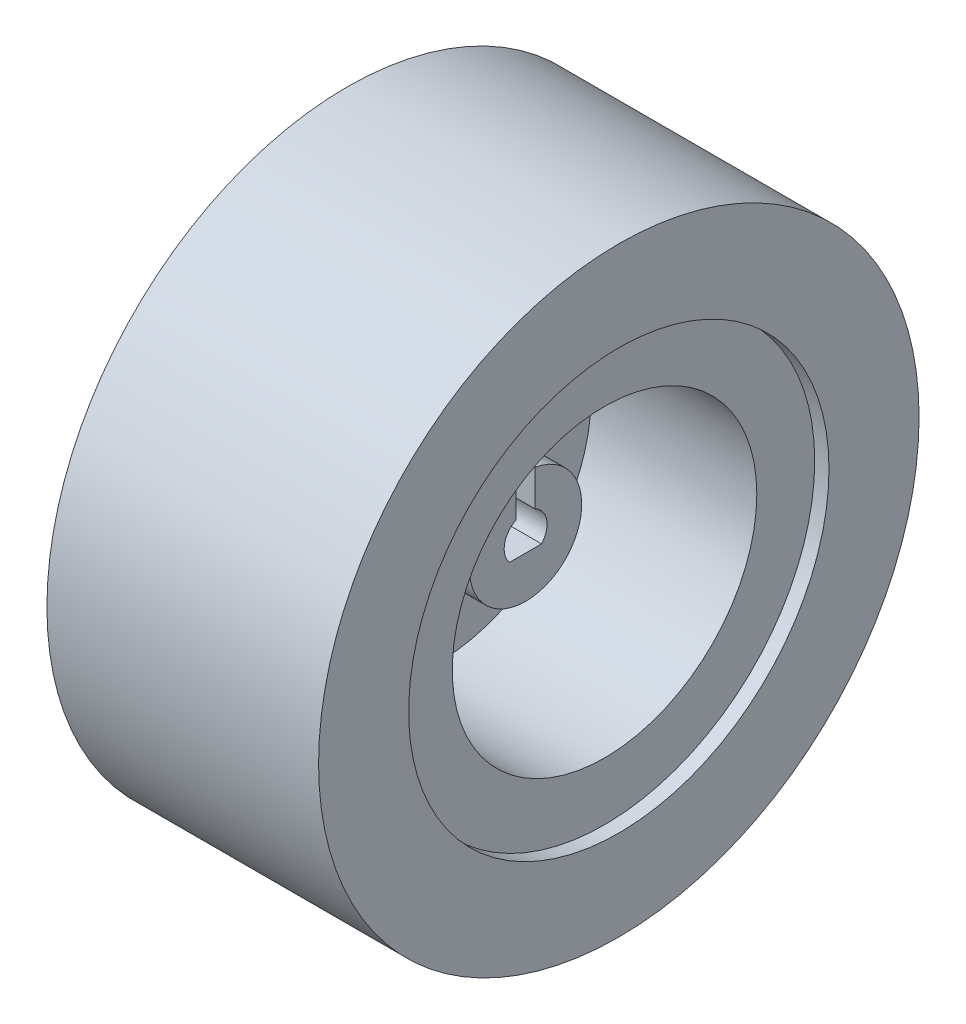
ISO-10303-21;
HEADER;
FILE_DESCRIPTION(('STEP AP214'),'2;1');
FILE_NAME('part.step','',(''),(''),'','','');
FILE_SCHEMA(('AUTOMOTIVE_DESIGN { 1 0 10303 214 1 1 1 1 }'));
ENDSEC;
DATA;
#1=APPLICATION_CONTEXT('core data for automotive mechanical design processes');
#2=APPLICATION_PROTOCOL_DEFINITION('international standard','automotive_design',2000,#1);
#3=PRODUCT_CONTEXT('',#1,'mechanical');
#4=PRODUCT('Part','Part','',(#3));
#5=PRODUCT_RELATED_PRODUCT_CATEGORY('part','',(#4));
#6=PRODUCT_DEFINITION_FORMATION('','',#4);
#7=PRODUCT_DEFINITION_CONTEXT('part definition',#1,'design');
#8=PRODUCT_DEFINITION('design','',#6,#7);
#9=PRODUCT_DEFINITION_SHAPE('','',#8);
#10=(LENGTH_UNIT() NAMED_UNIT(*) SI_UNIT(.MILLI.,.METRE.));
#11=(NAMED_UNIT(*) PLANE_ANGLE_UNIT() SI_UNIT($,.RADIAN.));
#12=(NAMED_UNIT(*) SI_UNIT($,.STERADIAN.) SOLID_ANGLE_UNIT());
#13=UNCERTAINTY_MEASURE_WITH_UNIT(LENGTH_MEASURE(1.E-05),#10,'distance_accuracy_value','');
#14=(GEOMETRIC_REPRESENTATION_CONTEXT(3) GLOBAL_UNCERTAINTY_ASSIGNED_CONTEXT((#13)) GLOBAL_UNIT_ASSIGNED_CONTEXT((#10,
#11,#12)) REPRESENTATION_CONTEXT('',''));
#15=CARTESIAN_POINT('',(0.,0.,0.));
#16=DIRECTION('',(0.,0.,1.));
#17=DIRECTION('',(1.,0.,0.));
#18=AXIS2_PLACEMENT_3D('',#15,#16,#17);
#19=CARTESIAN_POINT('',(-9.5,0.,0.));
#20=DIRECTION('',(1.,0.,0.));
#21=DIRECTION('',(0.,0.,-1.));
#22=AXIS2_PLACEMENT_3D('',#19,#20,#21);
#23=CYLINDRICAL_SURFACE('',#22,1.5);
#24=CARTESIAN_POINT('',(-5.,0.,0.));
#25=DIRECTION('',(-1.,0.,0.));
#26=DIRECTION('',(0.,0.,1.));
#27=AXIS2_PLACEMENT_3D('',#24,#25,#26);
#28=CIRCLE('',#27,1.5);
#29=CARTESIAN_POINT('',(-5.,1.34453523568555,0.665));
#30=VERTEX_POINT('',#29);
#31=CARTESIAN_POINT('',(-5.,-1.,1.11803398874989));
#32=VERTEX_POINT('',#31);
#33=EDGE_CURVE('E46',#30,#32,#28,.F.);
#34=ORIENTED_EDGE('',*,*,#33,.F.);
#35=DIRECTION('',(1.,0.,0.));
#36=VECTOR('',#35,1.);
#37=CARTESIAN_POINT('',(-9.5,1.34453523568555,0.665));
#38=LINE('',#37,#36);
#39=CARTESIAN_POINT('',(2.98,1.34453523568555,0.665));
#40=VERTEX_POINT('',#39);
#41=EDGE_CURVE('E122',#30,#40,#38,.T.);
#42=ORIENTED_EDGE('',*,*,#41,.T.);
#43=CARTESIAN_POINT('',(2.98,0.,0.));
#44=DIRECTION('',(1.,0.,0.));
#45=DIRECTION('',(0.,0.,-1.));
#46=AXIS2_PLACEMENT_3D('',#43,#44,#45);
#47=CIRCLE('',#46,1.5);
#48=CARTESIAN_POINT('',(2.98,-1.,1.11803398874989));
#49=VERTEX_POINT('',#48);
#50=EDGE_CURVE('E162',#40,#49,#47,.T.);
#51=ORIENTED_EDGE('',*,*,#50,.T.);
#52=DIRECTION('',(1.,0.,0.));
#53=VECTOR('',#52,1.);
#54=CARTESIAN_POINT('',(-9.5,-1.,1.11803398874989));
#55=LINE('',#54,#53);
#56=EDGE_CURVE('E53',#32,#49,#55,.T.);
#57=ORIENTED_EDGE('',*,*,#56,.F.);
#58=EDGE_LOOP('',(#34,#42,#51,#57));
#59=FACE_BOUND('',#58,.T.);
#60=ADVANCED_FACE('F32',(#59),#23,.F.);
#61=CARTESIAN_POINT('',(-9.5,8.87970558661225,0.664999999999999));
#62=DIRECTION('',(0.,0.,1.));
#63=DIRECTION('',(0.,-1.,0.));
#64=AXIS2_PLACEMENT_3D('',#61,#62,#63);
#65=PLANE('',#64);
#66=DIRECTION('',(0.,-1.,0.));
#67=VECTOR('',#66,1.);
#68=CARTESIAN_POINT('',(-5.,8.87970558661225,0.664999999999999));
#69=LINE('',#68,#67);
#70=CARTESIAN_POINT('',(-5.,8.87970558661225,0.664999999999999));
#71=VERTEX_POINT('',#70);
#72=EDGE_CURVE('E198',#71,#30,#69,.T.);
#73=ORIENTED_EDGE('',*,*,#72,.F.);
#74=DIRECTION('',(1.,0.,0.));
#75=VECTOR('',#74,1.);
#76=CARTESIAN_POINT('',(-9.5,8.87970558661225,0.664999999999999));
#77=LINE('',#76,#75);
#78=CARTESIAN_POINT('',(-3.1,8.87970558661225,0.664999999999999));
#79=VERTEX_POINT('',#78);
#80=EDGE_CURVE('E174',#71,#79,#77,.T.);
#81=ORIENTED_EDGE('',*,*,#80,.T.);
#82=DIRECTION('',(0.,-1.,0.));
#83=VECTOR('',#82,1.);
#84=CARTESIAN_POINT('',(-3.1,0.,0.665));
#85=LINE('',#84,#83);
#86=CARTESIAN_POINT('',(-3.1,3.86825542072909,0.665));
#87=VERTEX_POINT('',#86);
#88=EDGE_CURVE('E128',#79,#87,#85,.T.);
#89=ORIENTED_EDGE('',*,*,#88,.T.);
#90=DIRECTION('',(-1.,0.,0.));
#91=VECTOR('',#90,1.);
#92=CARTESIAN_POINT('',(2.98,3.86825542072909,0.665));
#93=LINE('',#92,#91);
#94=CARTESIAN_POINT('',(2.98,3.86825542072909,0.665));
#95=VERTEX_POINT('',#94);
#96=EDGE_CURVE('E125',#95,#87,#93,.T.);
#97=ORIENTED_EDGE('',*,*,#96,.F.);
#98=DIRECTION('',(0.,-1.,0.));
#99=VECTOR('',#98,1.);
#100=CARTESIAN_POINT('',(2.98,0.,0.665));
#101=LINE('',#100,#99);
#102=EDGE_CURVE('E40',#95,#40,#101,.T.);
#103=ORIENTED_EDGE('',*,*,#102,.T.);
#104=ORIENTED_EDGE('',*,*,#41,.F.);
#105=EDGE_LOOP('',(#73,#81,#89,#97,#103,#104));
#106=FACE_BOUND('',#105,.T.);
#107=ADVANCED_FACE('F169',(#106),#65,.F.);
#108=CARTESIAN_POINT('',(-9.5,8.87970558661225,0.664999999999999));
#109=DIRECTION('',(0.,1.,0.));
#110=DIRECTION('',(0.,0.,1.));
#111=AXIS2_PLACEMENT_3D('',#108,#109,#110);
#112=PLANE('',#111);
#113=DIRECTION('',(0.,0.,1.));
#114=VECTOR('',#113,1.);
#115=CARTESIAN_POINT('',(-5.,8.87970558661225,0.664999999999999));
#116=LINE('',#115,#114);
#117=CARTESIAN_POINT('',(-5.,8.87970558661225,-0.665000000000001));
#118=VERTEX_POINT('',#117);
#119=EDGE_CURVE('E186',#118,#71,#116,.T.);
#120=ORIENTED_EDGE('',*,*,#119,.F.);
#121=DIRECTION('',(1.,0.,0.));
#122=VECTOR('',#121,1.);
#123=CARTESIAN_POINT('',(-9.5,8.87970558661225,-0.665000000000001));
#124=LINE('',#123,#122);
#125=CARTESIAN_POINT('',(-3.1,8.87970558661225,-0.665000000000001));
#126=VERTEX_POINT('',#125);
#127=EDGE_CURVE('E113',#118,#126,#124,.T.);
#128=ORIENTED_EDGE('',*,*,#127,.T.);
#129=DIRECTION('',(0.,0.,1.));
#130=VECTOR('',#129,1.);
#131=CARTESIAN_POINT('',(-3.1,8.87970558661225,0.));
#132=LINE('',#131,#130);
#133=EDGE_CURVE('E130',#126,#79,#132,.T.);
#134=ORIENTED_EDGE('',*,*,#133,.T.);
#135=ORIENTED_EDGE('',*,*,#80,.F.);
#136=EDGE_LOOP('',(#120,#128,#134,#135));
#137=FACE_BOUND('',#136,.T.);
#138=ADVANCED_FACE('F182',(#137),#112,.F.);
#139=CARTESIAN_POINT('',(-9.5,8.87970558661225,-0.665000000000001));
#140=DIRECTION('',(0.,0.,-1.));
#141=DIRECTION('',(0.,1.,0.));
#142=AXIS2_PLACEMENT_3D('',#139,#140,#141);
#143=PLANE('',#142);
#144=DIRECTION('',(0.,1.,0.));
#145=VECTOR('',#144,1.);
#146=CARTESIAN_POINT('',(-5.,8.87970558661225,-0.665000000000001));
#147=LINE('',#146,#145);
#148=CARTESIAN_POINT('',(-5.,1.34453523568555,-0.665));
#149=VERTEX_POINT('',#148);
#150=EDGE_CURVE('E105',#149,#118,#147,.T.);
#151=ORIENTED_EDGE('',*,*,#150,.F.);
#152=DIRECTION('',(1.,0.,0.));
#153=VECTOR('',#152,1.);
#154=CARTESIAN_POINT('',(-9.5,1.34453523568555,-0.665));
#155=LINE('',#154,#153);
#156=CARTESIAN_POINT('',(2.98,1.34453523568555,-0.665));
#157=VERTEX_POINT('',#156);
#158=EDGE_CURVE('E104',#149,#157,#155,.T.);
#159=ORIENTED_EDGE('',*,*,#158,.T.);
#160=DIRECTION('',(0.,1.,0.));
#161=VECTOR('',#160,1.);
#162=CARTESIAN_POINT('',(2.98,0.,-0.665));
#163=LINE('',#162,#161);
#164=CARTESIAN_POINT('',(2.98,3.86825542072909,-0.665));
#165=VERTEX_POINT('',#164);
#166=EDGE_CURVE('E160',#157,#165,#163,.T.);
#167=ORIENTED_EDGE('',*,*,#166,.T.);
#168=DIRECTION('',(-1.,0.,0.));
#169=VECTOR('',#168,1.);
#170=CARTESIAN_POINT('',(2.98,3.86825542072909,-0.665));
#171=LINE('',#170,#169);
#172=CARTESIAN_POINT('',(-3.1,3.86825542072909,-0.665));
#173=VERTEX_POINT('',#172);
#174=EDGE_CURVE('E118',#173,#165,#171,.F.);
#175=ORIENTED_EDGE('',*,*,#174,.F.);
#176=DIRECTION('',(0.,1.,0.));
#177=VECTOR('',#176,1.);
#178=CARTESIAN_POINT('',(-3.1,0.,-0.665));
#179=LINE('',#178,#177);
#180=EDGE_CURVE('E121',#173,#126,#179,.T.);
#181=ORIENTED_EDGE('',*,*,#180,.T.);
#182=ORIENTED_EDGE('',*,*,#127,.F.);
#183=EDGE_LOOP('',(#151,#159,#167,#175,#181,#182));
#184=FACE_BOUND('',#183,.T.);
#185=ADVANCED_FACE('F189',(#184),#143,.F.);
#186=CARTESIAN_POINT('',(-9.5,0.,0.));
#187=DIRECTION('',(1.,0.,0.));
#188=DIRECTION('',(0.,0.,-1.));
#189=AXIS2_PLACEMENT_3D('',#186,#187,#188);
#190=CYLINDRICAL_SURFACE('',#189,1.5);
#191=CARTESIAN_POINT('',(-5.,0.,0.));
#192=DIRECTION('',(-1.,0.,0.));
#193=DIRECTION('',(0.,0.,1.));
#194=AXIS2_PLACEMENT_3D('',#191,#192,#193);
#195=CIRCLE('',#194,1.5);
#196=CARTESIAN_POINT('',(-5.,-1.,-1.11803398874989));
#197=VERTEX_POINT('',#196);
#198=EDGE_CURVE('E96',#197,#149,#195,.F.);
#199=ORIENTED_EDGE('',*,*,#198,.F.);
#200=DIRECTION('',(1.,0.,0.));
#201=VECTOR('',#200,1.);
#202=CARTESIAN_POINT('',(-9.5,-1.,-1.11803398874989));
#203=LINE('',#202,#201);
#204=CARTESIAN_POINT('',(2.98,-1.,-1.11803398874989));
#205=VERTEX_POINT('',#204);
#206=EDGE_CURVE('E103',#197,#205,#203,.T.);
#207=ORIENTED_EDGE('',*,*,#206,.T.);
#208=CARTESIAN_POINT('',(2.98,0.,0.));
#209=DIRECTION('',(1.,0.,0.));
#210=DIRECTION('',(0.,0.,-1.));
#211=AXIS2_PLACEMENT_3D('',#208,#209,#210);
#212=CIRCLE('',#211,1.5);
#213=EDGE_CURVE('E158',#205,#157,#212,.T.);
#214=ORIENTED_EDGE('',*,*,#213,.T.);
#215=ORIENTED_EDGE('',*,*,#158,.F.);
#216=EDGE_LOOP('',(#199,#207,#214,#215));
#217=FACE_BOUND('',#216,.T.);
#218=ADVANCED_FACE('F101',(#217),#190,.F.);
#219=CARTESIAN_POINT('',(-9.5,-1.,1.11803398874989));
#220=DIRECTION('',(0.,-1.,0.));
#221=DIRECTION('',(0.,0.,-1.));
#222=AXIS2_PLACEMENT_3D('',#219,#220,#221);
#223=PLANE('',#222);
#224=DIRECTION('',(0.,0.,-1.));
#225=VECTOR('',#224,1.);
#226=CARTESIAN_POINT('',(-5.,-1.,1.11803398874989));
#227=LINE('',#226,#225);
#228=EDGE_CURVE('E11',#32,#197,#227,.T.);
#229=ORIENTED_EDGE('',*,*,#228,.F.);
#230=ORIENTED_EDGE('',*,*,#56,.T.);
#231=DIRECTION('',(0.,0.,-1.));
#232=VECTOR('',#231,1.);
#233=CARTESIAN_POINT('',(2.98,-1.,0.));
#234=LINE('',#233,#232);
#235=EDGE_CURVE('E110',#49,#205,#234,.T.);
#236=ORIENTED_EDGE('',*,*,#235,.T.);
#237=ORIENTED_EDGE('',*,*,#206,.F.);
#238=EDGE_LOOP('',(#229,#230,#236,#237));
#239=FACE_BOUND('',#238,.T.);
#240=ADVANCED_FACE('F108',(#239),#223,.F.);
#241=CARTESIAN_POINT('',(-3.1,0.,0.));
#242=DIRECTION('',(1.,0.,0.));
#243=DIRECTION('',(0.,0.,-1.));
#244=AXIS2_PLACEMENT_3D('',#241,#242,#243);
#245=PLANE('',#244);
#246=ORIENTED_EDGE('',*,*,#88,.F.);
#247=ORIENTED_EDGE('',*,*,#133,.F.);
#248=ORIENTED_EDGE('',*,*,#180,.F.);
#249=CARTESIAN_POINT('',(-3.1,0.,0.));
#250=DIRECTION('',(1.,0.,0.));
#251=DIRECTION('',(0.,0.,-1.));
#252=AXIS2_PLACEMENT_3D('',#249,#250,#251);
#253=CIRCLE('',#252,3.925);
#254=EDGE_CURVE('E133',#87,#173,#253,.T.);
#255=ORIENTED_EDGE('',*,*,#254,.F.);
#256=EDGE_LOOP('',(#246,#247,#248,#255));
#257=FACE_BOUND('',#256,.T.);
#258=CARTESIAN_POINT('',(-3.1,0.,0.));
#259=DIRECTION('',(1.,0.,0.));
#260=DIRECTION('',(0.,0.,-1.));
#261=AXIS2_PLACEMENT_3D('',#258,#259,#260);
#262=CIRCLE('',#261,10.65);
#263=CARTESIAN_POINT('',(-3.1,0.,-10.65));
#264=VERTEX_POINT('',#263);
#265=EDGE_CURVE('E140',#264,#264,#262,.T.);
#266=ORIENTED_EDGE('',*,*,#265,.T.);
#267=EDGE_LOOP('',(#266));
#268=FACE_BOUND('',#267,.T.);
#269=ADVANCED_FACE('F192',(#257,#268),#245,.T.);
#270=CARTESIAN_POINT('',(-9.5,0.,0.));
#271=DIRECTION('',(1.,0.,0.));
#272=DIRECTION('',(0.,0.,-1.));
#273=AXIS2_PLACEMENT_3D('',#270,#271,#272);
#274=CYLINDRICAL_SURFACE('',#273,21.);
#275=CARTESIAN_POINT('',(-9.5,0.,0.));
#276=DIRECTION('',(1.,0.,0.));
#277=DIRECTION('',(0.,0.,-1.));
#278=AXIS2_PLACEMENT_3D('',#275,#276,#277);
#279=CIRCLE('',#278,21.);
#280=CARTESIAN_POINT('',(-9.5,0.,-21.));
#281=VERTEX_POINT('',#280);
#282=EDGE_CURVE('E154',#281,#281,#279,.T.);
#283=ORIENTED_EDGE('',*,*,#282,.T.);
#284=EDGE_LOOP('',(#283));
#285=FACE_BOUND('',#284,.T.);
#286=CARTESIAN_POINT('',(9.5,0.,0.));
#287=DIRECTION('',(1.,0.,0.));
#288=DIRECTION('',(0.,0.,-1.));
#289=AXIS2_PLACEMENT_3D('',#286,#287,#288);
#290=CIRCLE('',#289,21.);
#291=CARTESIAN_POINT('',(9.5,0.,-21.));
#292=VERTEX_POINT('',#291);
#293=EDGE_CURVE('E149',#292,#292,#290,.T.);
#294=ORIENTED_EDGE('',*,*,#293,.F.);
#295=EDGE_LOOP('',(#294));
#296=FACE_BOUND('',#295,.T.);
#297=ADVANCED_FACE('F34',(#285,#296),#274,.T.);
#298=CARTESIAN_POINT('',(-9.5,0.,0.));
#299=DIRECTION('',(1.,0.,0.));
#300=DIRECTION('',(0.,0.,-1.));
#301=AXIS2_PLACEMENT_3D('',#298,#299,#300);
#302=PLANE('',#301);
#303=CARTESIAN_POINT('',(-9.5,0.,0.));
#304=DIRECTION('',(-1.,0.,0.));
#305=DIRECTION('',(0.,0.,1.));
#306=AXIS2_PLACEMENT_3D('',#303,#304,#305);
#307=CIRCLE('',#306,14.7);
#308=CARTESIAN_POINT('',(-9.5,0.,14.7));
#309=VERTEX_POINT('',#308);
#310=EDGE_CURVE('E201',#309,#309,#307,.T.);
#311=ORIENTED_EDGE('',*,*,#310,.F.);
#312=EDGE_LOOP('',(#311));
#313=FACE_BOUND('',#312,.T.);
#314=ORIENTED_EDGE('',*,*,#282,.F.);
#315=EDGE_LOOP('',(#314));
#316=FACE_BOUND('',#315,.T.);
#317=ADVANCED_FACE('F214',(#313,#316),#302,.F.);
#318=CARTESIAN_POINT('',(9.5,0.,0.));
#319=DIRECTION('',(1.,0.,0.));
#320=DIRECTION('',(0.,0.,-1.));
#321=AXIS2_PLACEMENT_3D('',#318,#319,#320);
#322=PLANE('',#321);
#323=CARTESIAN_POINT('',(9.5,0.,0.));
#324=DIRECTION('',(1.,0.,0.));
#325=DIRECTION('',(0.,0.,-1.));
#326=AXIS2_PLACEMENT_3D('',#323,#324,#325);
#327=CIRCLE('',#326,14.7);
#328=CARTESIAN_POINT('',(9.5,0.,-14.7));
#329=VERTEX_POINT('',#328);
#330=EDGE_CURVE('E143',#329,#329,#327,.T.);
#331=ORIENTED_EDGE('',*,*,#330,.F.);
#332=EDGE_LOOP('',(#331));
#333=FACE_BOUND('',#332,.T.);
#334=ORIENTED_EDGE('',*,*,#293,.T.);
#335=EDGE_LOOP('',(#334));
#336=FACE_BOUND('',#335,.T.);
#337=ADVANCED_FACE('F217',(#333,#336),#322,.T.);
#338=CARTESIAN_POINT('',(8.5,0.,0.));
#339=DIRECTION('',(1.,0.,0.));
#340=DIRECTION('',(0.,0.,-1.));
#341=AXIS2_PLACEMENT_3D('',#338,#339,#340);
#342=CYLINDRICAL_SURFACE('',#341,14.7);
#343=CARTESIAN_POINT('',(8.5,0.,0.));
#344=DIRECTION('',(1.,0.,0.));
#345=DIRECTION('',(0.,0.,-1.));
#346=AXIS2_PLACEMENT_3D('',#343,#344,#345);
#347=CIRCLE('',#346,14.7);
#348=CARTESIAN_POINT('',(8.5,0.,-14.7));
#349=VERTEX_POINT('',#348);
#350=EDGE_CURVE('E146',#349,#349,#347,.T.);
#351=ORIENTED_EDGE('',*,*,#350,.F.);
#352=EDGE_LOOP('',(#351));
#353=FACE_BOUND('',#352,.T.);
#354=ORIENTED_EDGE('',*,*,#330,.T.);
#355=EDGE_LOOP('',(#354));
#356=FACE_BOUND('',#355,.T.);
#357=ADVANCED_FACE('F225',(#353,#356),#342,.F.);
#358=CARTESIAN_POINT('',(8.5,0.,0.));
#359=DIRECTION('',(1.,0.,0.));
#360=DIRECTION('',(0.,0.,-1.));
#361=AXIS2_PLACEMENT_3D('',#358,#359,#360);
#362=PLANE('',#361);
#363=CARTESIAN_POINT('',(8.5,0.,0.));
#364=DIRECTION('',(1.,0.,0.));
#365=DIRECTION('',(0.,0.,-1.));
#366=AXIS2_PLACEMENT_3D('',#363,#364,#365);
#367=CIRCLE('',#366,10.65);
#368=CARTESIAN_POINT('',(8.5,0.,-10.65));
#369=VERTEX_POINT('',#368);
#370=EDGE_CURVE('E137',#369,#369,#367,.T.);
#371=ORIENTED_EDGE('',*,*,#370,.F.);
#372=EDGE_LOOP('',(#371));
#373=FACE_BOUND('',#372,.T.);
#374=ORIENTED_EDGE('',*,*,#350,.T.);
#375=EDGE_LOOP('',(#374));
#376=FACE_BOUND('',#375,.T.);
#377=ADVANCED_FACE('F231',(#373,#376),#362,.T.);
#378=CARTESIAN_POINT('',(-3.1,0.,0.));
#379=DIRECTION('',(1.,0.,0.));
#380=DIRECTION('',(0.,0.,-1.));
#381=AXIS2_PLACEMENT_3D('',#378,#379,#380);
#382=CYLINDRICAL_SURFACE('',#381,10.65);
#383=ORIENTED_EDGE('',*,*,#265,.F.);
#384=EDGE_LOOP('',(#383));
#385=FACE_BOUND('',#384,.T.);
#386=ORIENTED_EDGE('',*,*,#370,.T.);
#387=EDGE_LOOP('',(#386));
#388=FACE_BOUND('',#387,.T.);
#389=ADVANCED_FACE('F248',(#385,#388),#382,.F.);
#390=CARTESIAN_POINT('',(2.98,0.,0.));
#391=DIRECTION('',(-1.,0.,0.));
#392=DIRECTION('',(0.,0.,1.));
#393=AXIS2_PLACEMENT_3D('',#390,#391,#392);
#394=CYLINDRICAL_SURFACE('',#393,3.925);
#395=CARTESIAN_POINT('',(2.98,0.,0.));
#396=DIRECTION('',(1.,0.,0.));
#397=DIRECTION('',(0.,0.,-1.));
#398=AXIS2_PLACEMENT_3D('',#395,#396,#397);
#399=CIRCLE('',#398,3.925);
#400=EDGE_CURVE('E134',#95,#165,#399,.T.);
#401=ORIENTED_EDGE('',*,*,#400,.F.);
#402=ORIENTED_EDGE('',*,*,#96,.T.);
#403=ORIENTED_EDGE('',*,*,#254,.T.);
#404=ORIENTED_EDGE('',*,*,#174,.T.);
#405=EDGE_LOOP('',(#401,#402,#403,#404));
#406=FACE_BOUND('',#405,.T.);
#407=ADVANCED_FACE('F195',(#406),#394,.T.);
#408=CARTESIAN_POINT('',(2.98,0.,0.));
#409=DIRECTION('',(1.,0.,0.));
#410=DIRECTION('',(0.,0.,-1.));
#411=AXIS2_PLACEMENT_3D('',#408,#409,#410);
#412=PLANE('',#411);
#413=ORIENTED_EDGE('',*,*,#102,.F.);
#414=ORIENTED_EDGE('',*,*,#400,.T.);
#415=ORIENTED_EDGE('',*,*,#166,.F.);
#416=ORIENTED_EDGE('',*,*,#213,.F.);
#417=ORIENTED_EDGE('',*,*,#235,.F.);
#418=ORIENTED_EDGE('',*,*,#50,.F.);
#419=EDGE_LOOP('',(#413,#414,#415,#416,#417,#418));
#420=FACE_BOUND('',#419,.T.);
#421=ADVANCED_FACE('F172',(#420),#412,.T.);
#422=CARTESIAN_POINT('',(-5.,0.,0.));
#423=DIRECTION('',(-1.,0.,0.));
#424=DIRECTION('',(0.,0.,1.));
#425=AXIS2_PLACEMENT_3D('',#422,#423,#424);
#426=PLANE('',#425);
#427=CARTESIAN_POINT('',(-5.,0.,0.));
#428=DIRECTION('',(-1.,0.,0.));
#429=DIRECTION('',(0.,0.,1.));
#430=AXIS2_PLACEMENT_3D('',#427,#428,#429);
#431=CIRCLE('',#430,14.7);
#432=CARTESIAN_POINT('',(-5.,0.,14.7));
#433=VERTEX_POINT('',#432);
#434=EDGE_CURVE('E106',#433,#433,#431,.T.);
#435=ORIENTED_EDGE('',*,*,#434,.T.);
#436=EDGE_LOOP('',(#435));
#437=FACE_BOUND('',#436,.T.);
#438=ORIENTED_EDGE('',*,*,#33,.T.);
#439=ORIENTED_EDGE('',*,*,#228,.T.);
#440=ORIENTED_EDGE('',*,*,#198,.T.);
#441=ORIENTED_EDGE('',*,*,#150,.T.);
#442=ORIENTED_EDGE('',*,*,#119,.T.);
#443=ORIENTED_EDGE('',*,*,#72,.T.);
#444=EDGE_LOOP('',(#438,#439,#440,#441,#442,#443));
#445=FACE_BOUND('',#444,.T.);
#446=ADVANCED_FACE('F95',(#437,#445),#426,.T.);
#447=CARTESIAN_POINT('',(-5.,0.,0.));
#448=DIRECTION('',(-1.,0.,0.));
#449=DIRECTION('',(0.,0.,1.));
#450=AXIS2_PLACEMENT_3D('',#447,#448,#449);
#451=CYLINDRICAL_SURFACE('',#450,14.7);
#452=ORIENTED_EDGE('',*,*,#434,.F.);
#453=EDGE_LOOP('',(#452));
#454=FACE_BOUND('',#453,.T.);
#455=ORIENTED_EDGE('',*,*,#310,.T.);
#456=EDGE_LOOP('',(#455));
#457=FACE_BOUND('',#456,.T.);
#458=ADVANCED_FACE('F208',(#454,#457),#451,.F.);
#459=CLOSED_SHELL('',(#60,#107,#138,#185,#218,#240,#269,#297,#317,#337,#357,#377,#389,#407,#421,
#446,#458));
#460=MANIFOLD_SOLID_BREP('B2',#459);
#461=ADVANCED_BREP_SHAPE_REPRESENTATION('',(#18,#460),#14);
#462=SHAPE_DEFINITION_REPRESENTATION(#9,#461);
ENDSEC;
END-ISO-10303-21;
